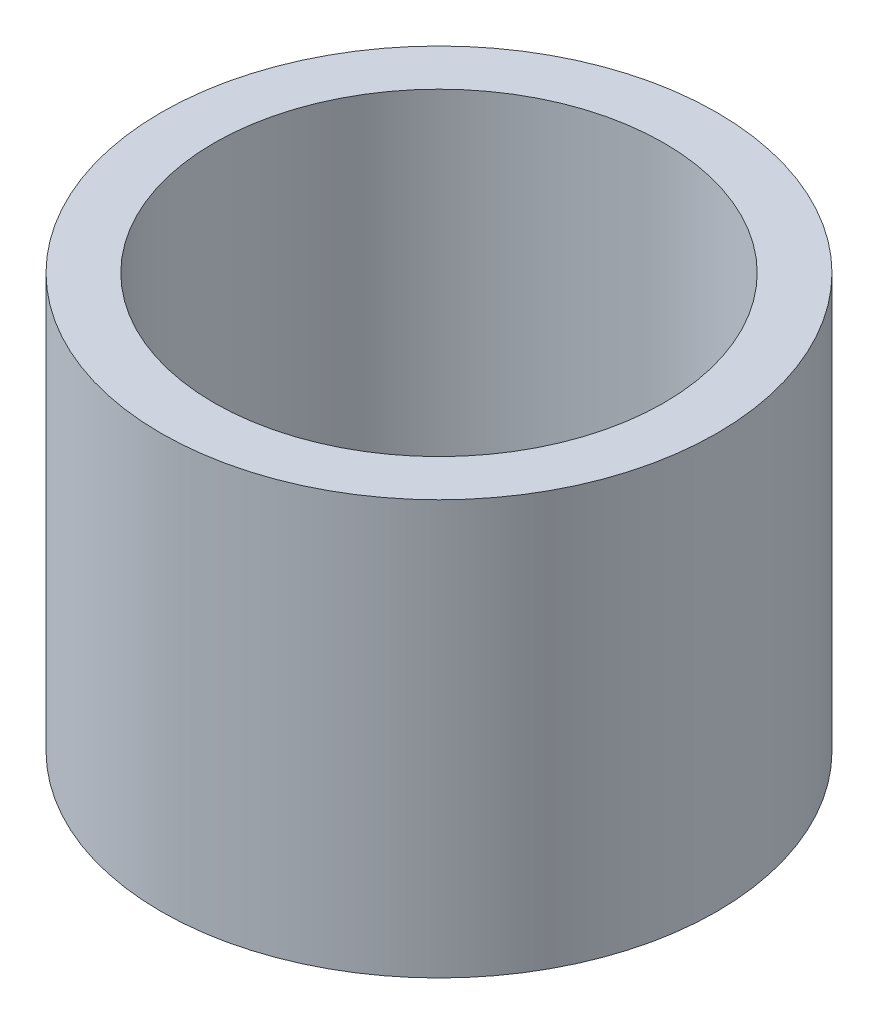
ISO-10303-21;
HEADER;
FILE_DESCRIPTION(('STEP AP214'),'2;1');
FILE_NAME('part.step','',(''),(''),'','','');
FILE_SCHEMA(('AUTOMOTIVE_DESIGN { 1 0 10303 214 1 1 1 1 }'));
ENDSEC;
DATA;
#1=APPLICATION_CONTEXT('core data for automotive mechanical design processes');
#2=APPLICATION_PROTOCOL_DEFINITION('international standard','automotive_design',2000,#1);
#3=PRODUCT_CONTEXT('',#1,'mechanical');
#4=PRODUCT('Part','Part','',(#3));
#5=PRODUCT_RELATED_PRODUCT_CATEGORY('part','',(#4));
#6=PRODUCT_DEFINITION_FORMATION('','',#4);
#7=PRODUCT_DEFINITION_CONTEXT('part definition',#1,'design');
#8=PRODUCT_DEFINITION('design','',#6,#7);
#9=PRODUCT_DEFINITION_SHAPE('','',#8);
#10=(LENGTH_UNIT() NAMED_UNIT(*) SI_UNIT(.MILLI.,.METRE.));
#11=(NAMED_UNIT(*) PLANE_ANGLE_UNIT() SI_UNIT($,.RADIAN.));
#12=(NAMED_UNIT(*) SI_UNIT($,.STERADIAN.) SOLID_ANGLE_UNIT());
#13=UNCERTAINTY_MEASURE_WITH_UNIT(LENGTH_MEASURE(1.E-05),#10,'distance_accuracy_value','');
#14=(GEOMETRIC_REPRESENTATION_CONTEXT(3) GLOBAL_UNCERTAINTY_ASSIGNED_CONTEXT((#13)) GLOBAL_UNIT_ASSIGNED_CONTEXT((#10,
#11,#12)) REPRESENTATION_CONTEXT('',''));
#15=CARTESIAN_POINT('',(0.,0.,0.));
#16=DIRECTION('',(0.,0.,1.));
#17=DIRECTION('',(1.,0.,0.));
#18=AXIS2_PLACEMENT_3D('',#15,#16,#17);
#19=CARTESIAN_POINT('',(0.,-76.2,0.));
#20=DIRECTION('',(0.,1.,0.));
#21=DIRECTION('',(0.,0.,1.));
#22=AXIS2_PLACEMENT_3D('',#19,#20,#21);
#23=CYLINDRICAL_SURFACE('',#22,51.1302);
#24=CARTESIAN_POINT('',(0.,-76.2,0.));
#25=DIRECTION('',(0.,1.,0.));
#26=DIRECTION('',(0.,0.,1.));
#27=AXIS2_PLACEMENT_3D('',#24,#25,#26);
#28=CIRCLE('',#27,51.1302);
#29=CARTESIAN_POINT('',(0.,-76.2,51.1302));
#30=VERTEX_POINT('',#29);
#31=EDGE_CURVE('E10',#30,#30,#28,.T.);
#32=CARTESIAN_POINT('',(0.,0.,0.));
#33=DIRECTION('',(0.,1.,0.));
#34=DIRECTION('',(0.,0.,1.));
#35=AXIS2_PLACEMENT_3D('',#32,#33,#34);
#36=CIRCLE('',#35,51.1302);
#37=CARTESIAN_POINT('',(0.,0.,51.1302));
#38=VERTEX_POINT('',#37);
#39=EDGE_CURVE('E42',#38,#38,#36,.T.);
#40=CARTESIAN_POINT('',(0.,-76.2,51.1302));
#41=CARTESIAN_POINT('',(0.,-75.40625,51.1302));
#42=CARTESIAN_POINT('',(0.,-74.6125,51.1302));
#43=CARTESIAN_POINT('',(0.,-73.025,51.1302));
#44=CARTESIAN_POINT('',(0.,-72.23125,51.1302));
#45=CARTESIAN_POINT('',(0.,-70.64375,51.1302));
#46=CARTESIAN_POINT('',(0.,-69.85,51.1302));
#47=CARTESIAN_POINT('',(0.,-68.2625,51.1302));
#48=CARTESIAN_POINT('',(0.,-67.46875,51.1302));
#49=CARTESIAN_POINT('',(0.,-65.88125,51.1302));
#50=CARTESIAN_POINT('',(0.,-65.0875,51.1302));
#51=CARTESIAN_POINT('',(0.,-63.5,51.1302));
#52=CARTESIAN_POINT('',(0.,-62.70625,51.1302));
#53=CARTESIAN_POINT('',(0.,-61.11875,51.1302));
#54=CARTESIAN_POINT('',(0.,-60.325,51.1302));
#55=CARTESIAN_POINT('',(0.,-58.7375,51.1302));
#56=CARTESIAN_POINT('',(0.,-57.94375,51.1302));
#57=CARTESIAN_POINT('',(0.,-56.35625,51.1302));
#58=CARTESIAN_POINT('',(0.,-55.5625,51.1302));
#59=CARTESIAN_POINT('',(0.,-53.975,51.1302));
#60=CARTESIAN_POINT('',(0.,-53.18125,51.1302));
#61=CARTESIAN_POINT('',(0.,-51.59375,51.1302));
#62=CARTESIAN_POINT('',(0.,-50.8,51.1302));
#63=CARTESIAN_POINT('',(0.,-49.2125,51.1302));
#64=CARTESIAN_POINT('',(0.,-48.41875,51.1302));
#65=CARTESIAN_POINT('',(0.,-46.83125,51.1302));
#66=CARTESIAN_POINT('',(0.,-46.0375,51.1302));
#67=CARTESIAN_POINT('',(0.,-44.45,51.1302));
#68=CARTESIAN_POINT('',(0.,-43.65625,51.1302));
#69=CARTESIAN_POINT('',(0.,-42.06875,51.1302));
#70=CARTESIAN_POINT('',(0.,-41.275,51.1302));
#71=CARTESIAN_POINT('',(0.,-39.6875,51.1302));
#72=CARTESIAN_POINT('',(0.,-38.89375,51.1302));
#73=CARTESIAN_POINT('',(0.,-37.30625,51.1302));
#74=CARTESIAN_POINT('',(0.,-36.5125,51.1302));
#75=CARTESIAN_POINT('',(0.,-34.925,51.1302));
#76=CARTESIAN_POINT('',(0.,-34.13125,51.1302));
#77=CARTESIAN_POINT('',(0.,-32.54375,51.1302));
#78=CARTESIAN_POINT('',(0.,-31.75,51.1302));
#79=CARTESIAN_POINT('',(0.,-30.1625,51.1302));
#80=CARTESIAN_POINT('',(0.,-29.36875,51.1302));
#81=CARTESIAN_POINT('',(0.,-27.78125,51.1302));
#82=CARTESIAN_POINT('',(0.,-26.9875,51.1302));
#83=CARTESIAN_POINT('',(0.,-25.4,51.1302));
#84=CARTESIAN_POINT('',(0.,-24.60625,51.1302));
#85=CARTESIAN_POINT('',(0.,-23.01875,51.1302));
#86=CARTESIAN_POINT('',(0.,-22.225,51.1302));
#87=CARTESIAN_POINT('',(0.,-20.6375,51.1302));
#88=CARTESIAN_POINT('',(0.,-19.84375,51.1302));
#89=CARTESIAN_POINT('',(0.,-18.25625,51.1302));
#90=CARTESIAN_POINT('',(0.,-17.4625,51.1302));
#91=CARTESIAN_POINT('',(0.,-15.875,51.1302));
#92=CARTESIAN_POINT('',(0.,-15.08125,51.1302));
#93=CARTESIAN_POINT('',(0.,-13.49375,51.1302));
#94=CARTESIAN_POINT('',(0.,-12.7,51.1302));
#95=CARTESIAN_POINT('',(0.,-11.1125,51.1302));
#96=CARTESIAN_POINT('',(0.,-10.31875,51.1302));
#97=CARTESIAN_POINT('',(0.,-8.73125,51.1302));
#98=CARTESIAN_POINT('',(0.,-7.93750000000001,51.1302));
#99=CARTESIAN_POINT('',(0.,-6.35,51.1302));
#100=CARTESIAN_POINT('',(0.,-5.55625,51.1302));
#101=CARTESIAN_POINT('',(0.,-3.96875,51.1302));
#102=CARTESIAN_POINT('',(0.,-3.175,51.1302));
#103=CARTESIAN_POINT('',(0.,-1.5875,51.1302));
#104=CARTESIAN_POINT('',(0.,-0.793750000000001,51.1302));
#105=CARTESIAN_POINT('',(0.,0.,51.1302));
#106=B_SPLINE_CURVE_WITH_KNOTS('',3,(#40,#41,#42,#43,#44,#45,#46,#47,#48,#49,#50,#51,#52,#53,
#54,#55,#56,#57,#58,#59,#60,#61,#62,#63,#64,#65,#66,#67,#68,#69,#70,#71,#72,#73,#74,#75,#76,#77,
#78,#79,#80,#81,#82,#83,#84,#85,#86,#87,#88,#89,#90,#91,#92,#93,#94,#95,#96,#97,#98,#99,#100,
#101,#102,#103,#104,#105),.UNSPECIFIED.,.F.,.F.,(4,2,2,2,2,2,2,2,2,2,2,2,2,2,2,2,2,2,2,2,2,2,2,
2,2,2,2,2,2,2,2,2,4),(0.,2.38125,4.7625,7.14375,9.52500000000001,11.90625,14.2875,16.66875,
19.05,21.43125,23.8125,26.19375,28.575,30.95625,33.3375,35.71875,38.1,40.48125,42.8625,45.24375,
47.625,50.00625,52.3875,54.76875,57.15,59.53125,61.9125,64.29375,66.675,69.05625,71.4375,
73.81875,76.2),.UNSPECIFIED.);
#107=EDGE_CURVE('BSEAM39',#30,#38,#106,.T.);
#108=ORIENTED_EDGE('',*,*,#31,.T.);
#109=ORIENTED_EDGE('',*,*,#39,.F.);
#110=ORIENTED_EDGE('',*,*,#107,.T.);
#111=ORIENTED_EDGE('',*,*,#107,.F.);
#112=EDGE_LOOP('',(#108,#110,#109,#111));
#113=FACE_BOUND('',#112,.T.);
#114=ADVANCED_FACE('F39',(#113),#23,.T.);
#115=CARTESIAN_POINT('',(0.,-76.2,0.));
#116=DIRECTION('',(0.,1.,0.));
#117=DIRECTION('',(0.,0.,1.));
#118=AXIS2_PLACEMENT_3D('',#115,#116,#117);
#119=PLANE('',#118);
#120=CARTESIAN_POINT('',(0.,-76.2,0.));
#121=DIRECTION('',(0.,1.,0.));
#122=DIRECTION('',(0.,0.,1.));
#123=AXIS2_PLACEMENT_3D('',#120,#121,#122);
#124=CIRCLE('',#123,41.402);
#125=CARTESIAN_POINT('',(0.,-76.2,41.402));
#126=VERTEX_POINT('',#125);
#127=EDGE_CURVE('E51',#126,#126,#124,.T.);
#128=ORIENTED_EDGE('',*,*,#127,.T.);
#129=EDGE_LOOP('',(#128));
#130=FACE_BOUND('',#129,.T.);
#131=ORIENTED_EDGE('',*,*,#31,.F.);
#132=EDGE_LOOP('',(#131));
#133=FACE_BOUND('',#132,.T.);
#134=ADVANCED_FACE('F61',(#130,#133),#119,.F.);
#135=CARTESIAN_POINT('',(0.,0.,0.));
#136=DIRECTION('',(0.,1.,0.));
#137=DIRECTION('',(0.,0.,1.));
#138=AXIS2_PLACEMENT_3D('',#135,#136,#137);
#139=PLANE('',#138);
#140=CARTESIAN_POINT('',(0.,0.,0.));
#141=DIRECTION('',(0.,1.,0.));
#142=DIRECTION('',(0.,0.,1.));
#143=AXIS2_PLACEMENT_3D('',#140,#141,#142);
#144=CIRCLE('',#143,41.402);
#145=CARTESIAN_POINT('',(0.,0.,41.402));
#146=VERTEX_POINT('',#145);
#147=EDGE_CURVE('E53',#146,#146,#144,.T.);
#148=ORIENTED_EDGE('',*,*,#147,.F.);
#149=EDGE_LOOP('',(#148));
#150=FACE_BOUND('',#149,.T.);
#151=ORIENTED_EDGE('',*,*,#39,.T.);
#152=EDGE_LOOP('',(#151));
#153=FACE_BOUND('',#152,.T.);
#154=ADVANCED_FACE('F67',(#150,#153),#139,.T.);
#155=CARTESIAN_POINT('',(0.,-76.2,0.));
#156=DIRECTION('',(0.,1.,0.));
#157=DIRECTION('',(0.,0.,1.));
#158=AXIS2_PLACEMENT_3D('',#155,#156,#157);
#159=CYLINDRICAL_SURFACE('',#158,41.402);
#160=CARTESIAN_POINT('',(0.,-76.2,41.402));
#161=CARTESIAN_POINT('',(0.,-75.40625,41.402));
#162=CARTESIAN_POINT('',(0.,-74.6125,41.402));
#163=CARTESIAN_POINT('',(0.,-73.025,41.402));
#164=CARTESIAN_POINT('',(0.,-72.23125,41.402));
#165=CARTESIAN_POINT('',(0.,-70.64375,41.402));
#166=CARTESIAN_POINT('',(0.,-69.85,41.402));
#167=CARTESIAN_POINT('',(0.,-68.2625,41.402));
#168=CARTESIAN_POINT('',(0.,-67.46875,41.402));
#169=CARTESIAN_POINT('',(0.,-65.88125,41.402));
#170=CARTESIAN_POINT('',(0.,-65.0875,41.402));
#171=CARTESIAN_POINT('',(0.,-63.5,41.402));
#172=CARTESIAN_POINT('',(0.,-62.70625,41.402));
#173=CARTESIAN_POINT('',(0.,-61.11875,41.402));
#174=CARTESIAN_POINT('',(0.,-60.325,41.402));
#175=CARTESIAN_POINT('',(0.,-58.7375,41.402));
#176=CARTESIAN_POINT('',(0.,-57.94375,41.402));
#177=CARTESIAN_POINT('',(0.,-56.35625,41.402));
#178=CARTESIAN_POINT('',(0.,-55.5625,41.402));
#179=CARTESIAN_POINT('',(0.,-53.975,41.402));
#180=CARTESIAN_POINT('',(0.,-53.18125,41.402));
#181=CARTESIAN_POINT('',(0.,-51.59375,41.402));
#182=CARTESIAN_POINT('',(0.,-50.8,41.402));
#183=CARTESIAN_POINT('',(0.,-49.2125,41.402));
#184=CARTESIAN_POINT('',(0.,-48.41875,41.402));
#185=CARTESIAN_POINT('',(0.,-46.83125,41.402));
#186=CARTESIAN_POINT('',(0.,-46.0375,41.402));
#187=CARTESIAN_POINT('',(0.,-44.45,41.402));
#188=CARTESIAN_POINT('',(0.,-43.65625,41.402));
#189=CARTESIAN_POINT('',(0.,-42.06875,41.402));
#190=CARTESIAN_POINT('',(0.,-41.275,41.402));
#191=CARTESIAN_POINT('',(0.,-39.6875,41.402));
#192=CARTESIAN_POINT('',(0.,-38.89375,41.402));
#193=CARTESIAN_POINT('',(0.,-37.30625,41.402));
#194=CARTESIAN_POINT('',(0.,-36.5125,41.402));
#195=CARTESIAN_POINT('',(0.,-34.925,41.402));
#196=CARTESIAN_POINT('',(0.,-34.13125,41.402));
#197=CARTESIAN_POINT('',(0.,-32.54375,41.402));
#198=CARTESIAN_POINT('',(0.,-31.75,41.402));
#199=CARTESIAN_POINT('',(0.,-30.1625,41.402));
#200=CARTESIAN_POINT('',(0.,-29.36875,41.402));
#201=CARTESIAN_POINT('',(0.,-27.78125,41.402));
#202=CARTESIAN_POINT('',(0.,-26.9875,41.402));
#203=CARTESIAN_POINT('',(0.,-25.4,41.402));
#204=CARTESIAN_POINT('',(0.,-24.60625,41.402));
#205=CARTESIAN_POINT('',(0.,-23.01875,41.402));
#206=CARTESIAN_POINT('',(0.,-22.225,41.402));
#207=CARTESIAN_POINT('',(0.,-20.6375,41.402));
#208=CARTESIAN_POINT('',(0.,-19.84375,41.402));
#209=CARTESIAN_POINT('',(0.,-18.25625,41.402));
#210=CARTESIAN_POINT('',(0.,-17.4625,41.402));
#211=CARTESIAN_POINT('',(0.,-15.875,41.402));
#212=CARTESIAN_POINT('',(0.,-15.08125,41.402));
#213=CARTESIAN_POINT('',(0.,-13.49375,41.402));
#214=CARTESIAN_POINT('',(0.,-12.7,41.402));
#215=CARTESIAN_POINT('',(0.,-11.1125,41.402));
#216=CARTESIAN_POINT('',(0.,-10.31875,41.402));
#217=CARTESIAN_POINT('',(0.,-8.73125,41.402));
#218=CARTESIAN_POINT('',(0.,-7.93750000000001,41.402));
#219=CARTESIAN_POINT('',(0.,-6.35,41.402));
#220=CARTESIAN_POINT('',(0.,-5.55625,41.402));
#221=CARTESIAN_POINT('',(0.,-3.96875,41.402));
#222=CARTESIAN_POINT('',(0.,-3.175,41.402));
#223=CARTESIAN_POINT('',(0.,-1.5875,41.402));
#224=CARTESIAN_POINT('',(0.,-0.793750000000001,41.402));
#225=CARTESIAN_POINT('',(0.,0.,41.402));
#226=B_SPLINE_CURVE_WITH_KNOTS('',3,(#160,#161,#162,#163,#164,#165,#166,#167,#168,#169,#170,
#171,#172,#173,#174,#175,#176,#177,#178,#179,#180,#181,#182,#183,#184,#185,#186,#187,#188,#189,
#190,#191,#192,#193,#194,#195,#196,#197,#198,#199,#200,#201,#202,#203,#204,#205,#206,#207,#208,
#209,#210,#211,#212,#213,#214,#215,#216,#217,#218,#219,#220,#221,#222,#223,#224,#225),
.UNSPECIFIED.,.F.,.F.,(4,2,2,2,2,2,2,2,2,2,2,2,2,2,2,2,2,2,2,2,2,2,2,2,2,2,2,2,2,2,2,2,4),(0.,
2.38124999999999,4.76249999999999,7.14374999999999,9.52499999999999,11.90625,14.2875,16.66875,
19.05,21.43125,23.8125,26.19375,28.575,30.95625,33.3375,35.71875,38.1,40.48125,42.8625,45.24375,
47.625,50.00625,52.3875,54.76875,57.15,59.53125,61.9125,64.29375,66.675,69.05625,71.4375,
73.81875,76.2),.UNSPECIFIED.);
#227=EDGE_CURVE('BSEAM64',#126,#146,#226,.T.);
#228=ORIENTED_EDGE('',*,*,#127,.F.);
#229=ORIENTED_EDGE('',*,*,#147,.T.);
#230=ORIENTED_EDGE('',*,*,#227,.T.);
#231=ORIENTED_EDGE('',*,*,#227,.F.);
#232=EDGE_LOOP('',(#228,#230,#229,#231));
#233=FACE_BOUND('',#232,.T.);
#234=ADVANCED_FACE('F64',(#233),#159,.F.);
#235=CLOSED_SHELL('',(#114,#134,#154,#234));
#236=MANIFOLD_SOLID_BREP('B2',#235);
#237=ADVANCED_BREP_SHAPE_REPRESENTATION('',(#18,#236),#14);
#238=SHAPE_DEFINITION_REPRESENTATION(#9,#237);
ENDSEC;
END-ISO-10303-21;
